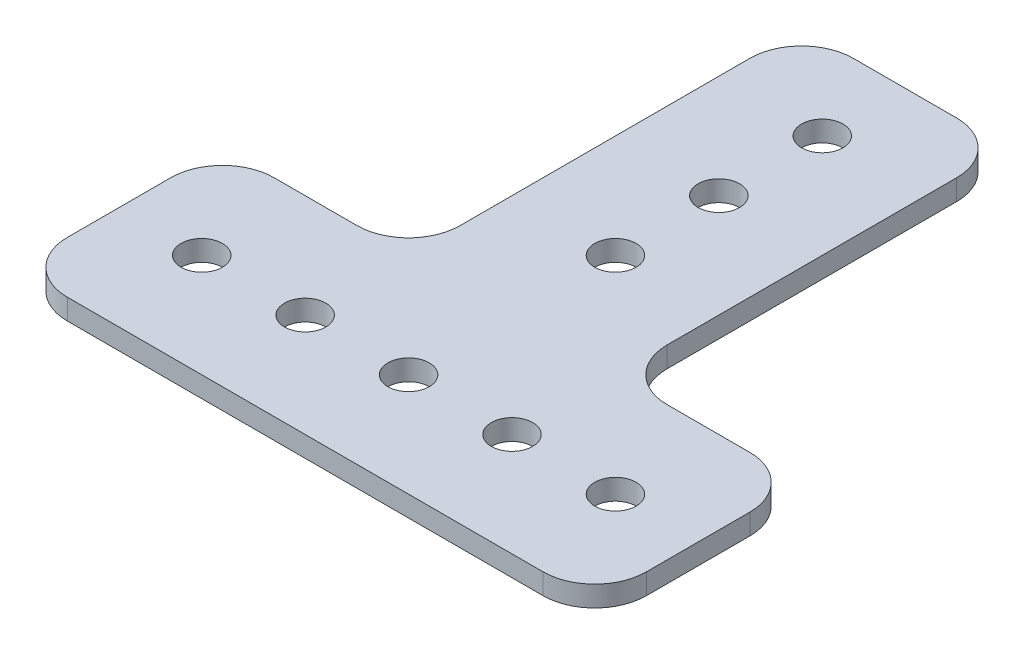
ISO-10303-21;
HEADER;
FILE_DESCRIPTION(('STEP AP214'),'2;1');
FILE_NAME('part.step','',(''),(''),'','','');
FILE_SCHEMA(('AUTOMOTIVE_DESIGN { 1 0 10303 214 1 1 1 1 }'));
ENDSEC;
DATA;
#1=APPLICATION_CONTEXT('core data for automotive mechanical design processes');
#2=APPLICATION_PROTOCOL_DEFINITION('international standard','automotive_design',2000,#1);
#3=PRODUCT_CONTEXT('',#1,'mechanical');
#4=PRODUCT('Part','Part','',(#3));
#5=PRODUCT_RELATED_PRODUCT_CATEGORY('part','',(#4));
#6=PRODUCT_DEFINITION_FORMATION('','',#4);
#7=PRODUCT_DEFINITION_CONTEXT('part definition',#1,'design');
#8=PRODUCT_DEFINITION('design','',#6,#7);
#9=PRODUCT_DEFINITION_SHAPE('','',#8);
#10=(LENGTH_UNIT() NAMED_UNIT(*) SI_UNIT(.MILLI.,.METRE.));
#11=(NAMED_UNIT(*) PLANE_ANGLE_UNIT() SI_UNIT($,.RADIAN.));
#12=(NAMED_UNIT(*) SI_UNIT($,.STERADIAN.) SOLID_ANGLE_UNIT());
#13=UNCERTAINTY_MEASURE_WITH_UNIT(LENGTH_MEASURE(1.E-05),#10,'distance_accuracy_value','');
#14=(GEOMETRIC_REPRESENTATION_CONTEXT(3) GLOBAL_UNCERTAINTY_ASSIGNED_CONTEXT((#13)) GLOBAL_UNIT_ASSIGNED_CONTEXT((#10,
#11,#12)) REPRESENTATION_CONTEXT('',''));
#15=CARTESIAN_POINT('',(0.,0.,0.));
#16=DIRECTION('',(0.,0.,1.));
#17=DIRECTION('',(1.,0.,0.));
#18=AXIS2_PLACEMENT_3D('',#15,#16,#17);
#19=CARTESIAN_POINT('',(0.,2.,20.));
#20=DIRECTION('',(1.,0.,0.));
#21=DIRECTION('',(0.,0.,-1.));
#22=AXIS2_PLACEMENT_3D('',#19,#20,#21);
#23=PLANE('',#22);
#24=DIRECTION('',(0.,0.,1.));
#25=VECTOR('',#24,1.);
#26=CARTESIAN_POINT('',(0.,0.,20.));
#27=LINE('',#26,#25);
#28=CARTESIAN_POINT('',(0.,0.,5.));
#29=VERTEX_POINT('',#28);
#30=CARTESIAN_POINT('',(0.,0.,15.));
#31=VERTEX_POINT('',#30);
#32=EDGE_CURVE('E316',#29,#31,#27,.T.);
#33=ORIENTED_EDGE('',*,*,#32,.T.);
#34=DIRECTION('',(0.,-1.,0.));
#35=VECTOR('',#34,1.);
#36=CARTESIAN_POINT('',(0.,2.,15.));
#37=LINE('',#36,#35);
#38=CARTESIAN_POINT('',(0.,2.,15.));
#39=VERTEX_POINT('',#38);
#40=EDGE_CURVE('E259',#31,#39,#37,.F.);
#41=ORIENTED_EDGE('',*,*,#40,.T.);
#42=DIRECTION('',(0.,0.,1.));
#43=VECTOR('',#42,1.);
#44=CARTESIAN_POINT('',(0.,2.,20.));
#45=LINE('',#44,#43);
#46=CARTESIAN_POINT('',(0.,2.,5.));
#47=VERTEX_POINT('',#46);
#48=EDGE_CURVE('E189',#47,#39,#45,.T.);
#49=ORIENTED_EDGE('',*,*,#48,.F.);
#50=DIRECTION('',(0.,-1.,0.));
#51=VECTOR('',#50,1.);
#52=CARTESIAN_POINT('',(0.,2.,5.));
#53=LINE('',#52,#51);
#54=EDGE_CURVE('E255',#47,#29,#53,.T.);
#55=ORIENTED_EDGE('',*,*,#54,.T.);
#56=EDGE_LOOP('',(#33,#41,#49,#55));
#57=FACE_BOUND('',#56,.T.);
#58=ADVANCED_FACE('F41',(#57),#23,.F.);
#59=CARTESIAN_POINT('',(56.,2.,20.));
#60=DIRECTION('',(0.,0.,-1.));
#61=DIRECTION('',(-1.,0.,0.));
#62=AXIS2_PLACEMENT_3D('',#59,#60,#61);
#63=PLANE('',#62);
#64=DIRECTION('',(1.,0.,0.));
#65=VECTOR('',#64,1.);
#66=CARTESIAN_POINT('',(56.,0.,20.));
#67=LINE('',#66,#65);
#68=CARTESIAN_POINT('',(5.,0.,20.));
#69=VERTEX_POINT('',#68);
#70=CARTESIAN_POINT('',(51.,0.,20.));
#71=VERTEX_POINT('',#70);
#72=EDGE_CURVE('E320',#69,#71,#67,.T.);
#73=ORIENTED_EDGE('',*,*,#72,.T.);
#74=DIRECTION('',(0.,-1.,0.));
#75=VECTOR('',#74,1.);
#76=CARTESIAN_POINT('',(51.,2.,20.));
#77=LINE('',#76,#75);
#78=CARTESIAN_POINT('',(51.,2.,20.));
#79=VERTEX_POINT('',#78);
#80=EDGE_CURVE('E252',#71,#79,#77,.F.);
#81=ORIENTED_EDGE('',*,*,#80,.T.);
#82=DIRECTION('',(1.,0.,0.));
#83=VECTOR('',#82,1.);
#84=CARTESIAN_POINT('',(56.,2.,20.));
#85=LINE('',#84,#83);
#86=CARTESIAN_POINT('',(5.,2.,20.));
#87=VERTEX_POINT('',#86);
#88=EDGE_CURVE('E302',#87,#79,#85,.T.);
#89=ORIENTED_EDGE('',*,*,#88,.F.);
#90=DIRECTION('',(0.,-1.,0.));
#91=VECTOR('',#90,1.);
#92=CARTESIAN_POINT('',(5.,2.,20.));
#93=LINE('',#92,#91);
#94=EDGE_CURVE('E248',#87,#69,#93,.T.);
#95=ORIENTED_EDGE('',*,*,#94,.T.);
#96=EDGE_LOOP('',(#73,#81,#89,#95));
#97=FACE_BOUND('',#96,.T.);
#98=ADVANCED_FACE('F355',(#97),#63,.F.);
#99=CARTESIAN_POINT('',(56.,2.,0.));
#100=DIRECTION('',(-1.,0.,0.));
#101=DIRECTION('',(0.,0.,1.));
#102=AXIS2_PLACEMENT_3D('',#99,#100,#101);
#103=PLANE('',#102);
#104=DIRECTION('',(0.,0.,-1.));
#105=VECTOR('',#104,1.);
#106=CARTESIAN_POINT('',(56.,0.,0.));
#107=LINE('',#106,#105);
#108=CARTESIAN_POINT('',(56.,0.,15.));
#109=VERTEX_POINT('',#108);
#110=CARTESIAN_POINT('',(56.,0.,5.));
#111=VERTEX_POINT('',#110);
#112=EDGE_CURVE('E324',#109,#111,#107,.T.);
#113=ORIENTED_EDGE('',*,*,#112,.T.);
#114=DIRECTION('',(0.,-1.,0.));
#115=VECTOR('',#114,1.);
#116=CARTESIAN_POINT('',(56.,2.,5.));
#117=LINE('',#116,#115);
#118=CARTESIAN_POINT('',(56.,2.,5.));
#119=VERTEX_POINT('',#118);
#120=EDGE_CURVE('E245',#111,#119,#117,.F.);
#121=ORIENTED_EDGE('',*,*,#120,.T.);
#122=DIRECTION('',(0.,0.,-1.));
#123=VECTOR('',#122,1.);
#124=CARTESIAN_POINT('',(56.,2.,0.));
#125=LINE('',#124,#123);
#126=CARTESIAN_POINT('',(56.,2.,15.));
#127=VERTEX_POINT('',#126);
#128=EDGE_CURVE('E298',#127,#119,#125,.T.);
#129=ORIENTED_EDGE('',*,*,#128,.F.);
#130=DIRECTION('',(0.,-1.,0.));
#131=VECTOR('',#130,1.);
#132=CARTESIAN_POINT('',(56.,2.,15.));
#133=LINE('',#132,#131);
#134=EDGE_CURVE('E241',#127,#109,#133,.T.);
#135=ORIENTED_EDGE('',*,*,#134,.T.);
#136=EDGE_LOOP('',(#113,#121,#129,#135));
#137=FACE_BOUND('',#136,.T.);
#138=ADVANCED_FACE('F361',(#137),#103,.F.);
#139=CARTESIAN_POINT('',(38.,2.,0.));
#140=DIRECTION('',(0.,0.,1.));
#141=DIRECTION('',(1.,0.,0.));
#142=AXIS2_PLACEMENT_3D('',#139,#140,#141);
#143=PLANE('',#142);
#144=DIRECTION('',(-1.,0.,0.));
#145=VECTOR('',#144,1.);
#146=CARTESIAN_POINT('',(38.,0.,0.));
#147=LINE('',#146,#145);
#148=CARTESIAN_POINT('',(51.,0.,0.));
#149=VERTEX_POINT('',#148);
#150=CARTESIAN_POINT('',(43.,0.,0.));
#151=VERTEX_POINT('',#150);
#152=EDGE_CURVE('E328',#149,#151,#147,.T.);
#153=ORIENTED_EDGE('',*,*,#152,.T.);
#154=DIRECTION('',(0.,-1.,0.));
#155=VECTOR('',#154,1.);
#156=CARTESIAN_POINT('',(43.,2.,0.));
#157=LINE('',#156,#155);
#158=CARTESIAN_POINT('',(43.,2.,0.));
#159=VERTEX_POINT('',#158);
#160=EDGE_CURVE('E63',#151,#159,#157,.F.);
#161=ORIENTED_EDGE('',*,*,#160,.T.);
#162=DIRECTION('',(-1.,0.,0.));
#163=VECTOR('',#162,1.);
#164=CARTESIAN_POINT('',(38.,2.,0.));
#165=LINE('',#164,#163);
#166=CARTESIAN_POINT('',(51.,2.,0.));
#167=VERTEX_POINT('',#166);
#168=EDGE_CURVE('E295',#167,#159,#165,.T.);
#169=ORIENTED_EDGE('',*,*,#168,.F.);
#170=DIRECTION('',(0.,-1.,0.));
#171=VECTOR('',#170,1.);
#172=CARTESIAN_POINT('',(51.,2.,0.));
#173=LINE('',#172,#171);
#174=EDGE_CURVE('E237',#167,#149,#173,.T.);
#175=ORIENTED_EDGE('',*,*,#174,.T.);
#176=EDGE_LOOP('',(#153,#161,#169,#175));
#177=FACE_BOUND('',#176,.T.);
#178=ADVANCED_FACE('F352',(#177),#143,.F.);
#179=CARTESIAN_POINT('',(38.,2.,-38.));
#180=DIRECTION('',(-1.,0.,0.));
#181=DIRECTION('',(0.,0.,1.));
#182=AXIS2_PLACEMENT_3D('',#179,#180,#181);
#183=PLANE('',#182);
#184=DIRECTION('',(0.,0.,-1.));
#185=VECTOR('',#184,1.);
#186=CARTESIAN_POINT('',(38.,2.,-38.));
#187=LINE('',#186,#185);
#188=CARTESIAN_POINT('',(38.,2.,-5.));
#189=VERTEX_POINT('',#188);
#190=CARTESIAN_POINT('',(38.,2.,-33.));
#191=VERTEX_POINT('',#190);
#192=EDGE_CURVE('E292',#189,#191,#187,.T.);
#193=ORIENTED_EDGE('',*,*,#192,.F.);
#194=DIRECTION('',(0.,-1.,0.));
#195=VECTOR('',#194,1.);
#196=CARTESIAN_POINT('',(38.,0.,-5.));
#197=LINE('',#196,#195);
#198=CARTESIAN_POINT('',(38.,0.,-5.));
#199=VERTEX_POINT('',#198);
#200=EDGE_CURVE('E273',#189,#199,#197,.T.);
#201=ORIENTED_EDGE('',*,*,#200,.T.);
#202=DIRECTION('',(0.,0.,-1.));
#203=VECTOR('',#202,1.);
#204=CARTESIAN_POINT('',(38.,0.,-38.));
#205=LINE('',#204,#203);
#206=CARTESIAN_POINT('',(38.,0.,-33.));
#207=VERTEX_POINT('',#206);
#208=EDGE_CURVE('E191',#199,#207,#205,.T.);
#209=ORIENTED_EDGE('',*,*,#208,.T.);
#210=DIRECTION('',(0.,-1.,0.));
#211=VECTOR('',#210,1.);
#212=CARTESIAN_POINT('',(38.,2.,-33.));
#213=LINE('',#212,#211);
#214=EDGE_CURVE('E233',#207,#191,#213,.F.);
#215=ORIENTED_EDGE('',*,*,#214,.T.);
#216=EDGE_LOOP('',(#193,#201,#209,#215));
#217=FACE_BOUND('',#216,.T.);
#218=ADVANCED_FACE('F333',(#217),#183,.F.);
#219=CARTESIAN_POINT('',(18.,2.,-38.));
#220=DIRECTION('',(0.,0.,1.));
#221=DIRECTION('',(1.,0.,0.));
#222=AXIS2_PLACEMENT_3D('',#219,#220,#221);
#223=PLANE('',#222);
#224=DIRECTION('',(-1.,0.,0.));
#225=VECTOR('',#224,1.);
#226=CARTESIAN_POINT('',(18.,0.,-38.));
#227=LINE('',#226,#225);
#228=CARTESIAN_POINT('',(33.,0.,-38.));
#229=VERTEX_POINT('',#228);
#230=CARTESIAN_POINT('',(23.,0.,-38.));
#231=VERTEX_POINT('',#230);
#232=EDGE_CURVE('E185',#229,#231,#227,.T.);
#233=ORIENTED_EDGE('',*,*,#232,.T.);
#234=DIRECTION('',(0.,-1.,0.));
#235=VECTOR('',#234,1.);
#236=CARTESIAN_POINT('',(23.,2.,-38.));
#237=LINE('',#236,#235);
#238=CARTESIAN_POINT('',(23.,2.,-38.));
#239=VERTEX_POINT('',#238);
#240=EDGE_CURVE('E160',#231,#239,#237,.F.);
#241=ORIENTED_EDGE('',*,*,#240,.T.);
#242=DIRECTION('',(-1.,0.,0.));
#243=VECTOR('',#242,1.);
#244=CARTESIAN_POINT('',(18.,2.,-38.));
#245=LINE('',#244,#243);
#246=CARTESIAN_POINT('',(33.,2.,-38.));
#247=VERTEX_POINT('',#246);
#248=EDGE_CURVE('E288',#247,#239,#245,.T.);
#249=ORIENTED_EDGE('',*,*,#248,.F.);
#250=DIRECTION('',(0.,-1.,0.));
#251=VECTOR('',#250,1.);
#252=CARTESIAN_POINT('',(33.,2.,-38.));
#253=LINE('',#252,#251);
#254=EDGE_CURVE('E165',#247,#229,#253,.T.);
#255=ORIENTED_EDGE('',*,*,#254,.T.);
#256=EDGE_LOOP('',(#233,#241,#249,#255));
#257=FACE_BOUND('',#256,.T.);
#258=ADVANCED_FACE('F343',(#257),#223,.F.);
#259=CARTESIAN_POINT('',(18.,2.,0.));
#260=DIRECTION('',(1.,0.,0.));
#261=DIRECTION('',(0.,0.,-1.));
#262=AXIS2_PLACEMENT_3D('',#259,#260,#261);
#263=PLANE('',#262);
#264=DIRECTION('',(0.,0.,1.));
#265=VECTOR('',#264,1.);
#266=CARTESIAN_POINT('',(18.,0.,0.));
#267=LINE('',#266,#265);
#268=CARTESIAN_POINT('',(18.,0.,-33.));
#269=VERTEX_POINT('',#268);
#270=CARTESIAN_POINT('',(18.,0.,-5.));
#271=VERTEX_POINT('',#270);
#272=EDGE_CURVE('E172',#269,#271,#267,.T.);
#273=ORIENTED_EDGE('',*,*,#272,.T.);
#274=DIRECTION('',(0.,-1.,0.));
#275=VECTOR('',#274,1.);
#276=CARTESIAN_POINT('',(18.,2.,-5.));
#277=LINE('',#276,#275);
#278=CARTESIAN_POINT('',(18.,2.,-5.));
#279=VERTEX_POINT('',#278);
#280=EDGE_CURVE('E270',#271,#279,#277,.F.);
#281=ORIENTED_EDGE('',*,*,#280,.T.);
#282=DIRECTION('',(0.,0.,1.));
#283=VECTOR('',#282,1.);
#284=CARTESIAN_POINT('',(18.,2.,0.));
#285=LINE('',#284,#283);
#286=CARTESIAN_POINT('',(18.,2.,-33.));
#287=VERTEX_POINT('',#286);
#288=EDGE_CURVE('E175',#287,#279,#285,.T.);
#289=ORIENTED_EDGE('',*,*,#288,.F.);
#290=DIRECTION('',(0.,-1.,0.));
#291=VECTOR('',#290,1.);
#292=CARTESIAN_POINT('',(18.,2.,-33.));
#293=LINE('',#292,#291);
#294=EDGE_CURVE('E159',#287,#269,#293,.T.);
#295=ORIENTED_EDGE('',*,*,#294,.T.);
#296=EDGE_LOOP('',(#273,#281,#289,#295));
#297=FACE_BOUND('',#296,.T.);
#298=ADVANCED_FACE('F171',(#297),#263,.F.);
#299=CARTESIAN_POINT('',(0.,2.,0.));
#300=DIRECTION('',(0.,0.,1.));
#301=DIRECTION('',(1.,0.,0.));
#302=AXIS2_PLACEMENT_3D('',#299,#300,#301);
#303=PLANE('',#302);
#304=DIRECTION('',(-1.,0.,0.));
#305=VECTOR('',#304,1.);
#306=CARTESIAN_POINT('',(0.,2.,0.));
#307=LINE('',#306,#305);
#308=CARTESIAN_POINT('',(13.,2.,0.));
#309=VERTEX_POINT('',#308);
#310=CARTESIAN_POINT('',(5.,2.,0.));
#311=VERTEX_POINT('',#310);
#312=EDGE_CURVE('E178',#309,#311,#307,.T.);
#313=ORIENTED_EDGE('',*,*,#312,.F.);
#314=DIRECTION('',(0.,-1.,0.));
#315=VECTOR('',#314,1.);
#316=CARTESIAN_POINT('',(13.,0.,0.));
#317=LINE('',#316,#315);
#318=CARTESIAN_POINT('',(13.,0.,0.));
#319=VERTEX_POINT('',#318);
#320=EDGE_CURVE('E266',#309,#319,#317,.T.);
#321=ORIENTED_EDGE('',*,*,#320,.T.);
#322=DIRECTION('',(-1.,0.,0.));
#323=VECTOR('',#322,1.);
#324=CARTESIAN_POINT('',(0.,0.,0.));
#325=LINE('',#324,#323);
#326=CARTESIAN_POINT('',(5.,0.,0.));
#327=VERTEX_POINT('',#326);
#328=EDGE_CURVE('E184',#319,#327,#325,.T.);
#329=ORIENTED_EDGE('',*,*,#328,.T.);
#330=DIRECTION('',(0.,-1.,0.));
#331=VECTOR('',#330,1.);
#332=CARTESIAN_POINT('',(5.,2.,0.));
#333=LINE('',#332,#331);
#334=EDGE_CURVE('E262',#327,#311,#333,.F.);
#335=ORIENTED_EDGE('',*,*,#334,.T.);
#336=EDGE_LOOP('',(#313,#321,#329,#335));
#337=FACE_BOUND('',#336,.T.);
#338=ADVANCED_FACE('F350',(#337),#303,.F.);
#339=CARTESIAN_POINT('',(0.,2.,0.));
#340=DIRECTION('',(0.,-1.,0.));
#341=DIRECTION('',(0.,0.,-1.));
#342=AXIS2_PLACEMENT_3D('',#339,#340,#341);
#343=PLANE('',#342);
#344=CARTESIAN_POINT('',(38.,2.,10.));
#345=DIRECTION('',(0.,-1.,0.));
#346=DIRECTION('',(0.,0.,-1.));
#347=AXIS2_PLACEMENT_3D('',#344,#345,#346);
#348=CIRCLE('',#347,2.);
#349=CARTESIAN_POINT('',(38.,2.,8.00000000000001));
#350=VERTEX_POINT('',#349);
#351=EDGE_CURVE('E602',#350,#350,#348,.T.);
#352=ORIENTED_EDGE('',*,*,#351,.T.);
#353=EDGE_LOOP('',(#352));
#354=FACE_BOUND('',#353,.T.);
#355=CARTESIAN_POINT('',(18.,2.,10.));
#356=DIRECTION('',(0.,-1.,0.));
#357=DIRECTION('',(0.,0.,-1.));
#358=AXIS2_PLACEMENT_3D('',#355,#356,#357);
#359=CIRCLE('',#358,2.);
#360=CARTESIAN_POINT('',(18.,2.,8.00000000000001));
#361=VERTEX_POINT('',#360);
#362=EDGE_CURVE('E615',#361,#361,#359,.T.);
#363=ORIENTED_EDGE('',*,*,#362,.T.);
#364=EDGE_LOOP('',(#363));
#365=FACE_BOUND('',#364,.T.);
#366=CARTESIAN_POINT('',(28.,2.,-20.));
#367=DIRECTION('',(0.,-1.,0.));
#368=DIRECTION('',(0.,0.,-1.));
#369=AXIS2_PLACEMENT_3D('',#366,#367,#368);
#370=CIRCLE('',#369,2.);
#371=CARTESIAN_POINT('',(28.,2.,-22.));
#372=VERTEX_POINT('',#371);
#373=EDGE_CURVE('E623',#372,#372,#370,.T.);
#374=ORIENTED_EDGE('',*,*,#373,.T.);
#375=EDGE_LOOP('',(#374));
#376=FACE_BOUND('',#375,.T.);
#377=CARTESIAN_POINT('',(28.,2.,-30.));
#378=DIRECTION('',(0.,-1.,0.));
#379=DIRECTION('',(0.,0.,-1.));
#380=AXIS2_PLACEMENT_3D('',#377,#378,#379);
#381=CIRCLE('',#380,2.);
#382=CARTESIAN_POINT('',(28.,2.,-32.));
#383=VERTEX_POINT('',#382);
#384=EDGE_CURVE('E631',#383,#383,#381,.T.);
#385=ORIENTED_EDGE('',*,*,#384,.T.);
#386=EDGE_LOOP('',(#385));
#387=FACE_BOUND('',#386,.T.);
#388=CARTESIAN_POINT('',(28.,2.,-9.99999999999999));
#389=DIRECTION('',(0.,-1.,0.));
#390=DIRECTION('',(0.,0.,-1.));
#391=AXIS2_PLACEMENT_3D('',#388,#389,#390);
#392=CIRCLE('',#391,2.);
#393=CARTESIAN_POINT('',(28.,2.,-12.));
#394=VERTEX_POINT('',#393);
#395=EDGE_CURVE('E639',#394,#394,#392,.T.);
#396=ORIENTED_EDGE('',*,*,#395,.T.);
#397=EDGE_LOOP('',(#396));
#398=FACE_BOUND('',#397,.T.);
#399=CARTESIAN_POINT('',(28.,2.,10.));
#400=DIRECTION('',(0.,-1.,0.));
#401=DIRECTION('',(0.,0.,-1.));
#402=AXIS2_PLACEMENT_3D('',#399,#400,#401);
#403=CIRCLE('',#402,2.);
#404=CARTESIAN_POINT('',(28.,2.,8.00000000000001));
#405=VERTEX_POINT('',#404);
#406=EDGE_CURVE('E647',#405,#405,#403,.T.);
#407=ORIENTED_EDGE('',*,*,#406,.T.);
#408=EDGE_LOOP('',(#407));
#409=FACE_BOUND('',#408,.T.);
#410=CARTESIAN_POINT('',(8.,2.,10.));
#411=DIRECTION('',(0.,-1.,0.));
#412=DIRECTION('',(0.,0.,-1.));
#413=AXIS2_PLACEMENT_3D('',#410,#411,#412);
#414=CIRCLE('',#413,2.);
#415=CARTESIAN_POINT('',(8.,2.,8.00000000000001));
#416=VERTEX_POINT('',#415);
#417=EDGE_CURVE('E655',#416,#416,#414,.T.);
#418=ORIENTED_EDGE('',*,*,#417,.T.);
#419=EDGE_LOOP('',(#418));
#420=FACE_BOUND('',#419,.T.);
#421=CARTESIAN_POINT('',(48.,2.,10.));
#422=DIRECTION('',(0.,-1.,0.));
#423=DIRECTION('',(0.,0.,-1.));
#424=AXIS2_PLACEMENT_3D('',#421,#422,#423);
#425=CIRCLE('',#424,2.);
#426=CARTESIAN_POINT('',(48.,2.,8.00000000000001));
#427=VERTEX_POINT('',#426);
#428=EDGE_CURVE('E313',#427,#427,#425,.T.);
#429=ORIENTED_EDGE('',*,*,#428,.T.);
#430=EDGE_LOOP('',(#429));
#431=FACE_BOUND('',#430,.T.);
#432=ORIENTED_EDGE('',*,*,#248,.T.);
#433=CARTESIAN_POINT('',(23.,2.,-33.));
#434=DIRECTION('',(0.,-1.,0.));
#435=DIRECTION('',(0.,0.,-1.));
#436=AXIS2_PLACEMENT_3D('',#433,#434,#435);
#437=CIRCLE('',#436,5.);
#438=EDGE_CURVE('E230',#239,#287,#437,.F.);
#439=ORIENTED_EDGE('',*,*,#438,.T.);
#440=ORIENTED_EDGE('',*,*,#288,.T.);
#441=CARTESIAN_POINT('',(13.,2.,-5.));
#442=DIRECTION('',(0.,-1.,0.));
#443=DIRECTION('',(0.,0.,-1.));
#444=AXIS2_PLACEMENT_3D('',#441,#442,#443);
#445=CIRCLE('',#444,5.);
#446=EDGE_CURVE('E281',#279,#309,#445,.T.);
#447=ORIENTED_EDGE('',*,*,#446,.T.);
#448=ORIENTED_EDGE('',*,*,#312,.T.);
#449=CARTESIAN_POINT('',(5.,2.,5.));
#450=DIRECTION('',(0.,-1.,0.));
#451=DIRECTION('',(0.,0.,-1.));
#452=AXIS2_PLACEMENT_3D('',#449,#450,#451);
#453=CIRCLE('',#452,5.);
#454=EDGE_CURVE('E215',#311,#47,#453,.F.);
#455=ORIENTED_EDGE('',*,*,#454,.T.);
#456=ORIENTED_EDGE('',*,*,#48,.T.);
#457=CARTESIAN_POINT('',(5.,2.,15.));
#458=DIRECTION('',(0.,-1.,0.));
#459=DIRECTION('',(0.,0.,-1.));
#460=AXIS2_PLACEMENT_3D('',#457,#458,#459);
#461=CIRCLE('',#460,5.);
#462=EDGE_CURVE('E218',#39,#87,#461,.F.);
#463=ORIENTED_EDGE('',*,*,#462,.T.);
#464=ORIENTED_EDGE('',*,*,#88,.T.);
#465=CARTESIAN_POINT('',(51.,2.,15.));
#466=DIRECTION('',(0.,-1.,0.));
#467=DIRECTION('',(0.,0.,-1.));
#468=AXIS2_PLACEMENT_3D('',#465,#466,#467);
#469=CIRCLE('',#468,5.);
#470=EDGE_CURVE('E221',#79,#127,#469,.F.);
#471=ORIENTED_EDGE('',*,*,#470,.T.);
#472=ORIENTED_EDGE('',*,*,#128,.T.);
#473=CARTESIAN_POINT('',(51.,2.,5.));
#474=DIRECTION('',(0.,-1.,0.));
#475=DIRECTION('',(0.,0.,-1.));
#476=AXIS2_PLACEMENT_3D('',#473,#474,#475);
#477=CIRCLE('',#476,5.);
#478=EDGE_CURVE('E224',#119,#167,#477,.F.);
#479=ORIENTED_EDGE('',*,*,#478,.T.);
#480=ORIENTED_EDGE('',*,*,#168,.T.);
#481=CARTESIAN_POINT('',(43.,2.,-5.));
#482=DIRECTION('',(0.,-1.,0.));
#483=DIRECTION('',(0.,0.,-1.));
#484=AXIS2_PLACEMENT_3D('',#481,#482,#483);
#485=CIRCLE('',#484,5.);
#486=EDGE_CURVE('E11',#159,#189,#485,.T.);
#487=ORIENTED_EDGE('',*,*,#486,.T.);
#488=ORIENTED_EDGE('',*,*,#192,.T.);
#489=CARTESIAN_POINT('',(33.,2.,-33.));
#490=DIRECTION('',(0.,-1.,0.));
#491=DIRECTION('',(0.,0.,-1.));
#492=AXIS2_PLACEMENT_3D('',#489,#490,#491);
#493=CIRCLE('',#492,5.);
#494=EDGE_CURVE('E227',#191,#247,#493,.F.);
#495=ORIENTED_EDGE('',*,*,#494,.T.);
#496=EDGE_LOOP('',(#432,#439,#440,#447,#448,#455,#456,#463,#464,#471,#472,#479,#480,#487,#488,#495));
#497=FACE_BOUND('',#496,.T.);
#498=ADVANCED_FACE('F341',(#354,#365,#376,#387,#398,#409,#420,#431,#497),#343,.F.);
#499=CARTESIAN_POINT('',(0.,0.,0.));
#500=DIRECTION('',(0.,-1.,0.));
#501=DIRECTION('',(0.,0.,-1.));
#502=AXIS2_PLACEMENT_3D('',#499,#500,#501);
#503=PLANE('',#502);
#504=CARTESIAN_POINT('',(38.,0.,10.));
#505=DIRECTION('',(0.,-1.,0.));
#506=DIRECTION('',(0.,0.,-1.));
#507=AXIS2_PLACEMENT_3D('',#504,#505,#506);
#508=CIRCLE('',#507,1.99999999999999);
#509=CARTESIAN_POINT('',(38.,0.,8.00000000000002));
#510=VERTEX_POINT('',#509);
#511=EDGE_CURVE('E605',#510,#510,#508,.T.);
#512=ORIENTED_EDGE('',*,*,#511,.F.);
#513=EDGE_LOOP('',(#512));
#514=FACE_BOUND('',#513,.T.);
#515=CARTESIAN_POINT('',(18.,0.,10.));
#516=DIRECTION('',(0.,-1.,0.));
#517=DIRECTION('',(0.,0.,-1.));
#518=AXIS2_PLACEMENT_3D('',#515,#516,#517);
#519=CIRCLE('',#518,1.99999999999999);
#520=CARTESIAN_POINT('',(18.,0.,8.00000000000002));
#521=VERTEX_POINT('',#520);
#522=EDGE_CURVE('E609',#521,#521,#519,.T.);
#523=ORIENTED_EDGE('',*,*,#522,.F.);
#524=EDGE_LOOP('',(#523));
#525=FACE_BOUND('',#524,.T.);
#526=CARTESIAN_POINT('',(28.,0.,-20.));
#527=DIRECTION('',(0.,-1.,0.));
#528=DIRECTION('',(0.,0.,-1.));
#529=AXIS2_PLACEMENT_3D('',#526,#527,#528);
#530=CIRCLE('',#529,1.99999999999999);
#531=CARTESIAN_POINT('',(28.,0.,-22.));
#532=VERTEX_POINT('',#531);
#533=EDGE_CURVE('E619',#532,#532,#530,.T.);
#534=ORIENTED_EDGE('',*,*,#533,.F.);
#535=EDGE_LOOP('',(#534));
#536=FACE_BOUND('',#535,.T.);
#537=CARTESIAN_POINT('',(28.,0.,-30.));
#538=DIRECTION('',(0.,-1.,0.));
#539=DIRECTION('',(0.,0.,-1.));
#540=AXIS2_PLACEMENT_3D('',#537,#538,#539);
#541=CIRCLE('',#540,2.);
#542=CARTESIAN_POINT('',(28.,0.,-32.));
#543=VERTEX_POINT('',#542);
#544=EDGE_CURVE('E627',#543,#543,#541,.T.);
#545=ORIENTED_EDGE('',*,*,#544,.F.);
#546=EDGE_LOOP('',(#545));
#547=FACE_BOUND('',#546,.T.);
#548=CARTESIAN_POINT('',(28.,0.,-9.99999999999999));
#549=DIRECTION('',(0.,-1.,0.));
#550=DIRECTION('',(0.,0.,-1.));
#551=AXIS2_PLACEMENT_3D('',#548,#549,#550);
#552=CIRCLE('',#551,2.);
#553=CARTESIAN_POINT('',(28.,0.,-12.));
#554=VERTEX_POINT('',#553);
#555=EDGE_CURVE('E635',#554,#554,#552,.T.);
#556=ORIENTED_EDGE('',*,*,#555,.F.);
#557=EDGE_LOOP('',(#556));
#558=FACE_BOUND('',#557,.T.);
#559=CARTESIAN_POINT('',(28.,0.,10.));
#560=DIRECTION('',(0.,-1.,0.));
#561=DIRECTION('',(0.,0.,-1.));
#562=AXIS2_PLACEMENT_3D('',#559,#560,#561);
#563=CIRCLE('',#562,2.);
#564=CARTESIAN_POINT('',(28.,0.,8.00000000000001));
#565=VERTEX_POINT('',#564);
#566=EDGE_CURVE('E643',#565,#565,#563,.T.);
#567=ORIENTED_EDGE('',*,*,#566,.F.);
#568=EDGE_LOOP('',(#567));
#569=FACE_BOUND('',#568,.T.);
#570=CARTESIAN_POINT('',(8.,0.,10.));
#571=DIRECTION('',(0.,-1.,0.));
#572=DIRECTION('',(0.,0.,-1.));
#573=AXIS2_PLACEMENT_3D('',#570,#571,#572);
#574=CIRCLE('',#573,2.);
#575=CARTESIAN_POINT('',(8.,0.,8.00000000000001));
#576=VERTEX_POINT('',#575);
#577=EDGE_CURVE('E651',#576,#576,#574,.T.);
#578=ORIENTED_EDGE('',*,*,#577,.F.);
#579=EDGE_LOOP('',(#578));
#580=FACE_BOUND('',#579,.T.);
#581=CARTESIAN_POINT('',(48.,0.,10.));
#582=DIRECTION('',(0.,-1.,0.));
#583=DIRECTION('',(0.,0.,-1.));
#584=AXIS2_PLACEMENT_3D('',#581,#582,#583);
#585=CIRCLE('',#584,2.);
#586=CARTESIAN_POINT('',(48.,0.,8.00000000000001));
#587=VERTEX_POINT('',#586);
#588=EDGE_CURVE('E658',#587,#587,#585,.T.);
#589=ORIENTED_EDGE('',*,*,#588,.F.);
#590=EDGE_LOOP('',(#589));
#591=FACE_BOUND('',#590,.T.);
#592=ORIENTED_EDGE('',*,*,#272,.F.);
#593=CARTESIAN_POINT('',(23.,0.,-33.));
#594=DIRECTION('',(0.,-1.,0.));
#595=DIRECTION('',(0.,0.,-1.));
#596=AXIS2_PLACEMENT_3D('',#593,#594,#595);
#597=CIRCLE('',#596,5.);
#598=EDGE_CURVE('E155',#269,#231,#597,.T.);
#599=ORIENTED_EDGE('',*,*,#598,.T.);
#600=ORIENTED_EDGE('',*,*,#232,.F.);
#601=CARTESIAN_POINT('',(33.,0.,-33.));
#602=DIRECTION('',(0.,-1.,0.));
#603=DIRECTION('',(0.,0.,-1.));
#604=AXIS2_PLACEMENT_3D('',#601,#602,#603);
#605=CIRCLE('',#604,5.);
#606=EDGE_CURVE('E166',#229,#207,#605,.T.);
#607=ORIENTED_EDGE('',*,*,#606,.T.);
#608=ORIENTED_EDGE('',*,*,#208,.F.);
#609=CARTESIAN_POINT('',(43.,0.,-5.));
#610=DIRECTION('',(0.,-1.,0.));
#611=DIRECTION('',(0.,0.,-1.));
#612=AXIS2_PLACEMENT_3D('',#609,#610,#611);
#613=CIRCLE('',#612,5.);
#614=EDGE_CURVE('E50',#199,#151,#613,.F.);
#615=ORIENTED_EDGE('',*,*,#614,.T.);
#616=ORIENTED_EDGE('',*,*,#152,.F.);
#617=CARTESIAN_POINT('',(51.,0.,5.));
#618=DIRECTION('',(0.,-1.,0.));
#619=DIRECTION('',(0.,0.,-1.));
#620=AXIS2_PLACEMENT_3D('',#617,#618,#619);
#621=CIRCLE('',#620,5.);
#622=EDGE_CURVE('E204',#149,#111,#621,.T.);
#623=ORIENTED_EDGE('',*,*,#622,.T.);
#624=ORIENTED_EDGE('',*,*,#112,.F.);
#625=CARTESIAN_POINT('',(51.,0.,15.));
#626=DIRECTION('',(0.,-1.,0.));
#627=DIRECTION('',(0.,0.,-1.));
#628=AXIS2_PLACEMENT_3D('',#625,#626,#627);
#629=CIRCLE('',#628,5.);
#630=EDGE_CURVE('E201',#109,#71,#629,.T.);
#631=ORIENTED_EDGE('',*,*,#630,.T.);
#632=ORIENTED_EDGE('',*,*,#72,.F.);
#633=CARTESIAN_POINT('',(5.,0.,15.));
#634=DIRECTION('',(0.,-1.,0.));
#635=DIRECTION('',(0.,0.,-1.));
#636=AXIS2_PLACEMENT_3D('',#633,#634,#635);
#637=CIRCLE('',#636,5.);
#638=EDGE_CURVE('E198',#69,#31,#637,.T.);
#639=ORIENTED_EDGE('',*,*,#638,.T.);
#640=ORIENTED_EDGE('',*,*,#32,.F.);
#641=CARTESIAN_POINT('',(5.,0.,5.));
#642=DIRECTION('',(0.,-1.,0.));
#643=DIRECTION('',(0.,0.,-1.));
#644=AXIS2_PLACEMENT_3D('',#641,#642,#643);
#645=CIRCLE('',#644,5.);
#646=EDGE_CURVE('E177',#29,#327,#645,.T.);
#647=ORIENTED_EDGE('',*,*,#646,.T.);
#648=ORIENTED_EDGE('',*,*,#328,.F.);
#649=CARTESIAN_POINT('',(13.,0.,-5.));
#650=DIRECTION('',(0.,-1.,0.));
#651=DIRECTION('',(0.,0.,-1.));
#652=AXIS2_PLACEMENT_3D('',#649,#650,#651);
#653=CIRCLE('',#652,5.);
#654=EDGE_CURVE('E182',#319,#271,#653,.F.);
#655=ORIENTED_EDGE('',*,*,#654,.T.);
#656=EDGE_LOOP('',(#592,#599,#600,#607,#608,#615,#616,#623,#624,#631,#632,#639,#640,#647,#648,#655));
#657=FACE_BOUND('',#656,.T.);
#658=ADVANCED_FACE('F180',(#514,#525,#536,#547,#558,#569,#580,#591,#657),#503,.T.);
#659=CARTESIAN_POINT('',(48.,0.,10.));
#660=DIRECTION('',(0.,-1.,0.));
#661=DIRECTION('',(0.,0.,-1.));
#662=AXIS2_PLACEMENT_3D('',#659,#660,#661);
#663=CYLINDRICAL_SURFACE('',#662,2.);
#664=ORIENTED_EDGE('',*,*,#428,.F.);
#665=EDGE_LOOP('',(#664));
#666=FACE_BOUND('',#665,.T.);
#667=ORIENTED_EDGE('',*,*,#588,.T.);
#668=EDGE_LOOP('',(#667));
#669=FACE_BOUND('',#668,.T.);
#670=ADVANCED_FACE('F471',(#666,#669),#663,.F.);
#671=CARTESIAN_POINT('',(8.,0.,10.));
#672=DIRECTION('',(0.,-1.,0.));
#673=DIRECTION('',(0.,0.,-1.));
#674=AXIS2_PLACEMENT_3D('',#671,#672,#673);
#675=CYLINDRICAL_SURFACE('',#674,2.);
#676=ORIENTED_EDGE('',*,*,#417,.F.);
#677=EDGE_LOOP('',(#676));
#678=FACE_BOUND('',#677,.T.);
#679=ORIENTED_EDGE('',*,*,#577,.T.);
#680=EDGE_LOOP('',(#679));
#681=FACE_BOUND('',#680,.T.);
#682=ADVANCED_FACE('F461',(#678,#681),#675,.F.);
#683=CARTESIAN_POINT('',(28.,0.,10.));
#684=DIRECTION('',(0.,-1.,0.));
#685=DIRECTION('',(0.,0.,-1.));
#686=AXIS2_PLACEMENT_3D('',#683,#684,#685);
#687=CYLINDRICAL_SURFACE('',#686,2.);
#688=ORIENTED_EDGE('',*,*,#406,.F.);
#689=EDGE_LOOP('',(#688));
#690=FACE_BOUND('',#689,.T.);
#691=ORIENTED_EDGE('',*,*,#566,.T.);
#692=EDGE_LOOP('',(#691));
#693=FACE_BOUND('',#692,.T.);
#694=ADVANCED_FACE('F451',(#690,#693),#687,.F.);
#695=CARTESIAN_POINT('',(28.,0.,-9.99999999999999));
#696=DIRECTION('',(0.,-1.,0.));
#697=DIRECTION('',(0.,0.,-1.));
#698=AXIS2_PLACEMENT_3D('',#695,#696,#697);
#699=CYLINDRICAL_SURFACE('',#698,2.);
#700=ORIENTED_EDGE('',*,*,#395,.F.);
#701=EDGE_LOOP('',(#700));
#702=FACE_BOUND('',#701,.T.);
#703=ORIENTED_EDGE('',*,*,#555,.T.);
#704=EDGE_LOOP('',(#703));
#705=FACE_BOUND('',#704,.T.);
#706=ADVANCED_FACE('F440',(#702,#705),#699,.F.);
#707=CARTESIAN_POINT('',(28.,0.,-30.));
#708=DIRECTION('',(0.,-1.,0.));
#709=DIRECTION('',(0.,0.,-1.));
#710=AXIS2_PLACEMENT_3D('',#707,#708,#709);
#711=CYLINDRICAL_SURFACE('',#710,2.);
#712=ORIENTED_EDGE('',*,*,#384,.F.);
#713=EDGE_LOOP('',(#712));
#714=FACE_BOUND('',#713,.T.);
#715=ORIENTED_EDGE('',*,*,#544,.T.);
#716=EDGE_LOOP('',(#715));
#717=FACE_BOUND('',#716,.T.);
#718=ADVANCED_FACE('F368',(#714,#717),#711,.F.);
#719=CARTESIAN_POINT('',(23.,2.,-33.));
#720=DIRECTION('',(0.,-1.,0.));
#721=DIRECTION('',(0.,0.,-1.));
#722=AXIS2_PLACEMENT_3D('',#719,#720,#721);
#723=CYLINDRICAL_SURFACE('',#722,5.);
#724=ORIENTED_EDGE('',*,*,#438,.F.);
#725=ORIENTED_EDGE('',*,*,#240,.F.);
#726=ORIENTED_EDGE('',*,*,#598,.F.);
#727=ORIENTED_EDGE('',*,*,#294,.F.);
#728=EDGE_LOOP('',(#724,#725,#726,#727));
#729=FACE_BOUND('',#728,.T.);
#730=ADVANCED_FACE('F158',(#729),#723,.T.);
#731=CARTESIAN_POINT('',(33.,2.,-33.));
#732=DIRECTION('',(0.,-1.,0.));
#733=DIRECTION('',(0.,0.,-1.));
#734=AXIS2_PLACEMENT_3D('',#731,#732,#733);
#735=CYLINDRICAL_SURFACE('',#734,5.);
#736=ORIENTED_EDGE('',*,*,#494,.F.);
#737=ORIENTED_EDGE('',*,*,#214,.F.);
#738=ORIENTED_EDGE('',*,*,#606,.F.);
#739=ORIENTED_EDGE('',*,*,#254,.F.);
#740=EDGE_LOOP('',(#736,#737,#738,#739));
#741=FACE_BOUND('',#740,.T.);
#742=ADVANCED_FACE('F339',(#741),#735,.T.);
#743=CARTESIAN_POINT('',(51.,2.,5.));
#744=DIRECTION('',(0.,-1.,0.));
#745=DIRECTION('',(0.,0.,-1.));
#746=AXIS2_PLACEMENT_3D('',#743,#744,#745);
#747=CYLINDRICAL_SURFACE('',#746,5.);
#748=ORIENTED_EDGE('',*,*,#478,.F.);
#749=ORIENTED_EDGE('',*,*,#120,.F.);
#750=ORIENTED_EDGE('',*,*,#622,.F.);
#751=ORIENTED_EDGE('',*,*,#174,.F.);
#752=EDGE_LOOP('',(#748,#749,#750,#751));
#753=FACE_BOUND('',#752,.T.);
#754=ADVANCED_FACE('F371',(#753),#747,.T.);
#755=CARTESIAN_POINT('',(51.,2.,15.));
#756=DIRECTION('',(0.,-1.,0.));
#757=DIRECTION('',(0.,0.,-1.));
#758=AXIS2_PLACEMENT_3D('',#755,#756,#757);
#759=CYLINDRICAL_SURFACE('',#758,5.);
#760=ORIENTED_EDGE('',*,*,#470,.F.);
#761=ORIENTED_EDGE('',*,*,#80,.F.);
#762=ORIENTED_EDGE('',*,*,#630,.F.);
#763=ORIENTED_EDGE('',*,*,#134,.F.);
#764=EDGE_LOOP('',(#760,#761,#762,#763));
#765=FACE_BOUND('',#764,.T.);
#766=ADVANCED_FACE('F374',(#765),#759,.T.);
#767=CARTESIAN_POINT('',(5.,2.,15.));
#768=DIRECTION('',(0.,-1.,0.));
#769=DIRECTION('',(0.,0.,-1.));
#770=AXIS2_PLACEMENT_3D('',#767,#768,#769);
#771=CYLINDRICAL_SURFACE('',#770,5.);
#772=ORIENTED_EDGE('',*,*,#462,.F.);
#773=ORIENTED_EDGE('',*,*,#40,.F.);
#774=ORIENTED_EDGE('',*,*,#638,.F.);
#775=ORIENTED_EDGE('',*,*,#94,.F.);
#776=EDGE_LOOP('',(#772,#773,#774,#775));
#777=FACE_BOUND('',#776,.T.);
#778=ADVANCED_FACE('F378',(#777),#771,.T.);
#779=CARTESIAN_POINT('',(5.,2.,5.));
#780=DIRECTION('',(0.,-1.,0.));
#781=DIRECTION('',(0.,0.,-1.));
#782=AXIS2_PLACEMENT_3D('',#779,#780,#781);
#783=CYLINDRICAL_SURFACE('',#782,5.);
#784=ORIENTED_EDGE('',*,*,#454,.F.);
#785=ORIENTED_EDGE('',*,*,#334,.F.);
#786=ORIENTED_EDGE('',*,*,#646,.F.);
#787=ORIENTED_EDGE('',*,*,#54,.F.);
#788=EDGE_LOOP('',(#784,#785,#786,#787));
#789=FACE_BOUND('',#788,.T.);
#790=ADVANCED_FACE('F382',(#789),#783,.T.);
#791=CARTESIAN_POINT('',(13.,2.,-5.));
#792=DIRECTION('',(0.,1.,0.));
#793=DIRECTION('',(0.,0.,1.));
#794=AXIS2_PLACEMENT_3D('',#791,#792,#793);
#795=CYLINDRICAL_SURFACE('',#794,5.);
#796=ORIENTED_EDGE('',*,*,#446,.F.);
#797=ORIENTED_EDGE('',*,*,#280,.F.);
#798=ORIENTED_EDGE('',*,*,#654,.F.);
#799=ORIENTED_EDGE('',*,*,#320,.F.);
#800=EDGE_LOOP('',(#796,#797,#798,#799));
#801=FACE_BOUND('',#800,.T.);
#802=ADVANCED_FACE('F385',(#801),#795,.F.);
#803=CARTESIAN_POINT('',(43.,2.,-5.));
#804=DIRECTION('',(0.,1.,0.));
#805=DIRECTION('',(0.,0.,1.));
#806=AXIS2_PLACEMENT_3D('',#803,#804,#805);
#807=CYLINDRICAL_SURFACE('',#806,5.);
#808=ORIENTED_EDGE('',*,*,#486,.F.);
#809=ORIENTED_EDGE('',*,*,#160,.F.);
#810=ORIENTED_EDGE('',*,*,#614,.F.);
#811=ORIENTED_EDGE('',*,*,#200,.F.);
#812=EDGE_LOOP('',(#808,#809,#810,#811));
#813=FACE_BOUND('',#812,.T.);
#814=ADVANCED_FACE('F43',(#813),#807,.F.);
#815=CARTESIAN_POINT('',(28.,0.,-20.));
#816=DIRECTION('',(0.,-1.,0.));
#817=DIRECTION('',(0.,0.,-1.));
#818=AXIS2_PLACEMENT_3D('',#815,#816,#817);
#819=CYLINDRICAL_SURFACE('',#818,1.99999999999999);
#820=ORIENTED_EDGE('',*,*,#373,.F.);
#821=EDGE_LOOP('',(#820));
#822=FACE_BOUND('',#821,.T.);
#823=ORIENTED_EDGE('',*,*,#533,.T.);
#824=EDGE_LOOP('',(#823));
#825=FACE_BOUND('',#824,.T.);
#826=ADVANCED_FACE('F392',(#822,#825),#819,.F.);
#827=CARTESIAN_POINT('',(18.,0.,10.));
#828=DIRECTION('',(0.,-1.,0.));
#829=DIRECTION('',(0.,0.,-1.));
#830=AXIS2_PLACEMENT_3D('',#827,#828,#829);
#831=CYLINDRICAL_SURFACE('',#830,1.99999999999999);
#832=ORIENTED_EDGE('',*,*,#362,.F.);
#833=EDGE_LOOP('',(#832));
#834=FACE_BOUND('',#833,.T.);
#835=ORIENTED_EDGE('',*,*,#522,.T.);
#836=EDGE_LOOP('',(#835));
#837=FACE_BOUND('',#836,.T.);
#838=ADVANCED_FACE('F575',(#834,#837),#831,.F.);
#839=CARTESIAN_POINT('',(38.,0.,10.));
#840=DIRECTION('',(0.,-1.,0.));
#841=DIRECTION('',(0.,0.,-1.));
#842=AXIS2_PLACEMENT_3D('',#839,#840,#841);
#843=CYLINDRICAL_SURFACE('',#842,1.99999999999999);
#844=ORIENTED_EDGE('',*,*,#351,.F.);
#845=EDGE_LOOP('',(#844));
#846=FACE_BOUND('',#845,.T.);
#847=ORIENTED_EDGE('',*,*,#511,.T.);
#848=EDGE_LOOP('',(#847));
#849=FACE_BOUND('',#848,.T.);
#850=ADVANCED_FACE('F584',(#846,#849),#843,.F.);
#851=CLOSED_SHELL('',(#58,#98,#138,#178,#218,#258,#298,#338,#498,#658,#670,#682,#694,#706,#718,
#730,#742,#754,#766,#778,#790,#802,#814,#826,#838,#850));
#852=MANIFOLD_SOLID_BREP('B2',#851);
#853=ADVANCED_BREP_SHAPE_REPRESENTATION('',(#18,#852),#14);
#854=SHAPE_DEFINITION_REPRESENTATION(#9,#853);
ENDSEC;
END-ISO-10303-21;
